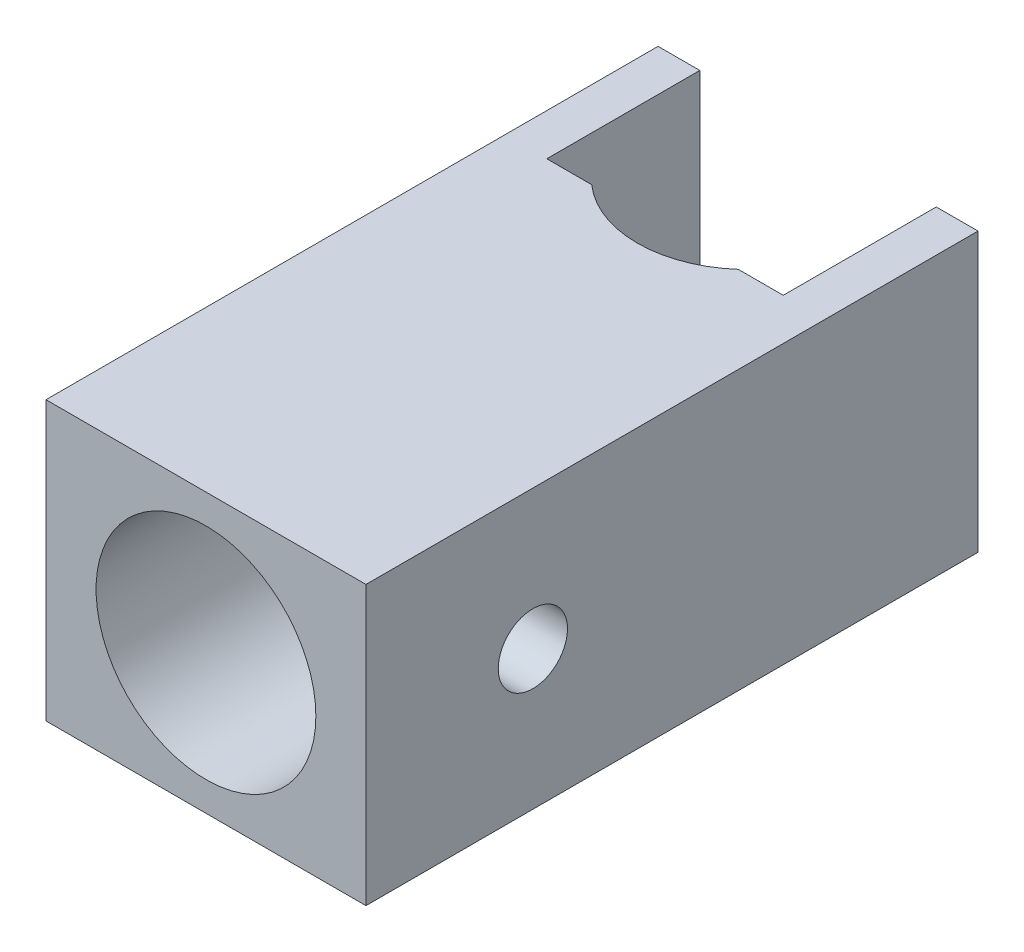
ISO-10303-21;
HEADER;
FILE_DESCRIPTION(('STEP AP214'),'2;1');
FILE_NAME('part.step','',(''),(''),'','','');
FILE_SCHEMA(('AUTOMOTIVE_DESIGN { 1 0 10303 214 1 1 1 1 }'));
ENDSEC;
DATA;
#1=APPLICATION_CONTEXT('core data for automotive mechanical design processes');
#2=APPLICATION_PROTOCOL_DEFINITION('international standard','automotive_design',2000,#1);
#3=PRODUCT_CONTEXT('',#1,'mechanical');
#4=PRODUCT('Part','Part','',(#3));
#5=PRODUCT_RELATED_PRODUCT_CATEGORY('part','',(#4));
#6=PRODUCT_DEFINITION_FORMATION('','',#4);
#7=PRODUCT_DEFINITION_CONTEXT('part definition',#1,'design');
#8=PRODUCT_DEFINITION('design','',#6,#7);
#9=PRODUCT_DEFINITION_SHAPE('','',#8);
#10=(LENGTH_UNIT() NAMED_UNIT(*) SI_UNIT(.MILLI.,.METRE.));
#11=(NAMED_UNIT(*) PLANE_ANGLE_UNIT() SI_UNIT($,.RADIAN.));
#12=(NAMED_UNIT(*) SI_UNIT($,.STERADIAN.) SOLID_ANGLE_UNIT());
#13=UNCERTAINTY_MEASURE_WITH_UNIT(LENGTH_MEASURE(1.E-05),#10,'distance_accuracy_value','');
#14=(GEOMETRIC_REPRESENTATION_CONTEXT(3) GLOBAL_UNCERTAINTY_ASSIGNED_CONTEXT((#13)) GLOBAL_UNIT_ASSIGNED_CONTEXT((#10,
#11,#12)) REPRESENTATION_CONTEXT('',''));
#15=CARTESIAN_POINT('',(0.,0.,0.));
#16=DIRECTION('',(0.,0.,1.));
#17=DIRECTION('',(1.,0.,0.));
#18=AXIS2_PLACEMENT_3D('',#15,#16,#17);
#19=CARTESIAN_POINT('',(-4.25,0.,-6.49999999999998));
#20=DIRECTION('',(0.,0.,1.));
#21=DIRECTION('',(0.,-1.,0.));
#22=AXIS2_PLACEMENT_3D('',#19,#20,#21);
#23=PLANE('',#22);
#24=DIRECTION('',(1.,0.,0.));
#25=VECTOR('',#24,1.);
#26=CARTESIAN_POINT('',(-4.25,4.5,-6.5));
#27=LINE('',#26,#25);
#28=CARTESIAN_POINT('',(2.63391343821318,4.5,-6.5));
#29=VERTEX_POINT('',#28);
#30=CARTESIAN_POINT('',(4.25,4.5,-6.5));
#31=VERTEX_POINT('',#30);
#32=EDGE_CURVE('E132',#29,#31,#27,.T.);
#33=ORIENTED_EDGE('',*,*,#32,.F.);
#34=DIRECTION('',(0.,1.,0.));
#35=VECTOR('',#34,1.);
#36=CARTESIAN_POINT('',(2.63391343821315,-4.99999999999999,-6.49999999999997));
#37=LINE('',#36,#35);
#38=CARTESIAN_POINT('',(2.63391343821318,5.,-6.5));
#39=VERTEX_POINT('',#38);
#40=EDGE_CURVE('E11',#29,#39,#37,.T.);
#41=ORIENTED_EDGE('',*,*,#40,.T.);
#42=DIRECTION('',(1.,0.,0.));
#43=VECTOR('',#42,1.);
#44=CARTESIAN_POINT('',(-4.25,5.,-6.5));
#45=LINE('',#44,#43);
#46=CARTESIAN_POINT('',(4.25,5.,-6.5));
#47=VERTEX_POINT('',#46);
#48=EDGE_CURVE('E131',#39,#47,#45,.T.);
#49=ORIENTED_EDGE('',*,*,#48,.T.);
#50=DIRECTION('',(0.,-1.,0.));
#51=VECTOR('',#50,1.);
#52=CARTESIAN_POINT('',(4.25,0.,-6.49999999999998));
#53=LINE('',#52,#51);
#54=EDGE_CURVE('E246',#47,#31,#53,.T.);
#55=ORIENTED_EDGE('',*,*,#54,.T.);
#56=EDGE_LOOP('',(#33,#41,#49,#55));
#57=FACE_BOUND('',#56,.T.);
#58=ADVANCED_FACE('F33',(#57),#23,.F.);
#59=CARTESIAN_POINT('',(0.,0.,-12.));
#60=DIRECTION('',(0.,0.,-1.));
#61=DIRECTION('',(-1.,0.,0.));
#62=AXIS2_PLACEMENT_3D('',#59,#60,#61);
#63=PLANE('',#62);
#64=DIRECTION('',(-1.,0.,0.));
#65=VECTOR('',#64,1.);
#66=CARTESIAN_POINT('',(-5.75,-5.,-12.));
#67=LINE('',#66,#65);
#68=CARTESIAN_POINT('',(5.75,-5.,-12.));
#69=VERTEX_POINT('',#68);
#70=CARTESIAN_POINT('',(4.25,-5.,-12.));
#71=VERTEX_POINT('',#70);
#72=EDGE_CURVE('E150',#69,#71,#67,.T.);
#73=ORIENTED_EDGE('',*,*,#72,.T.);
#74=DIRECTION('',(0.,-1.,0.));
#75=VECTOR('',#74,1.);
#76=CARTESIAN_POINT('',(4.25,0.,-12.));
#77=LINE('',#76,#75);
#78=CARTESIAN_POINT('',(4.25,5.,-12.));
#79=VERTEX_POINT('',#78);
#80=EDGE_CURVE('E249',#79,#71,#77,.T.);
#81=ORIENTED_EDGE('',*,*,#80,.F.);
#82=DIRECTION('',(1.,0.,0.));
#83=VECTOR('',#82,1.);
#84=CARTESIAN_POINT('',(-5.75,5.,-12.));
#85=LINE('',#84,#83);
#86=CARTESIAN_POINT('',(5.75,5.,-12.));
#87=VERTEX_POINT('',#86);
#88=EDGE_CURVE('E156',#79,#87,#85,.T.);
#89=ORIENTED_EDGE('',*,*,#88,.T.);
#90=DIRECTION('',(0.,-1.,0.));
#91=VECTOR('',#90,1.);
#92=CARTESIAN_POINT('',(5.75,-5.,-12.));
#93=LINE('',#92,#91);
#94=EDGE_CURVE('E146',#87,#69,#93,.T.);
#95=ORIENTED_EDGE('',*,*,#94,.T.);
#96=EDGE_LOOP('',(#73,#81,#89,#95));
#97=FACE_BOUND('',#96,.T.);
#98=ADVANCED_FACE('F299',(#97),#63,.T.);
#99=CARTESIAN_POINT('',(0.,0.,10.));
#100=DIRECTION('',(0.,0.,1.));
#101=DIRECTION('',(1.,0.,0.));
#102=AXIS2_PLACEMENT_3D('',#99,#100,#101);
#103=PLANE('',#102);
#104=DIRECTION('',(0.,-1.,0.));
#105=VECTOR('',#104,1.);
#106=CARTESIAN_POINT('',(-5.75,-5.,10.));
#107=LINE('',#106,#105);
#108=CARTESIAN_POINT('',(-5.75,5.,10.));
#109=VERTEX_POINT('',#108);
#110=CARTESIAN_POINT('',(-5.75,-5.,10.));
#111=VERTEX_POINT('',#110);
#112=EDGE_CURVE('E164',#109,#111,#107,.T.);
#113=ORIENTED_EDGE('',*,*,#112,.T.);
#114=DIRECTION('',(1.,0.,0.));
#115=VECTOR('',#114,1.);
#116=CARTESIAN_POINT('',(5.75,-5.,10.));
#117=LINE('',#116,#115);
#118=CARTESIAN_POINT('',(5.75,-5.,10.));
#119=VERTEX_POINT('',#118);
#120=EDGE_CURVE('E169',#111,#119,#117,.T.);
#121=ORIENTED_EDGE('',*,*,#120,.T.);
#122=DIRECTION('',(0.,1.,0.));
#123=VECTOR('',#122,1.);
#124=CARTESIAN_POINT('',(5.75,-5.,10.));
#125=LINE('',#124,#123);
#126=CARTESIAN_POINT('',(5.75,5.,10.));
#127=VERTEX_POINT('',#126);
#128=EDGE_CURVE('E171',#119,#127,#125,.T.);
#129=ORIENTED_EDGE('',*,*,#128,.T.);
#130=DIRECTION('',(-1.,0.,0.));
#131=VECTOR('',#130,1.);
#132=CARTESIAN_POINT('',(5.75,5.,10.));
#133=LINE('',#132,#131);
#134=EDGE_CURVE('E173',#127,#109,#133,.T.);
#135=ORIENTED_EDGE('',*,*,#134,.T.);
#136=EDGE_LOOP('',(#113,#121,#129,#135));
#137=FACE_BOUND('',#136,.T.);
#138=CARTESIAN_POINT('',(0.,0.,10.));
#139=DIRECTION('',(0.,0.,1.));
#140=DIRECTION('',(1.,0.,0.));
#141=AXIS2_PLACEMENT_3D('',#138,#139,#140);
#142=CIRCLE('',#141,3.95);
#143=CARTESIAN_POINT('',(3.95,0.,10.));
#144=VERTEX_POINT('',#143);
#145=EDGE_CURVE('E161',#144,#144,#142,.T.);
#146=ORIENTED_EDGE('',*,*,#145,.F.);
#147=EDGE_LOOP('',(#146));
#148=FACE_BOUND('',#147,.T.);
#149=ADVANCED_FACE('F291',(#137,#148),#103,.T.);
#150=CARTESIAN_POINT('',(-5.75,-5.,10.));
#151=DIRECTION('',(1.,0.,0.));
#152=DIRECTION('',(0.,0.,-1.));
#153=AXIS2_PLACEMENT_3D('',#150,#151,#152);
#154=PLANE('',#153);
#155=CARTESIAN_POINT('',(-5.75,0.,4.));
#156=DIRECTION('',(-1.,0.,0.));
#157=DIRECTION('',(0.,0.,1.));
#158=AXIS2_PLACEMENT_3D('',#155,#156,#157);
#159=CIRCLE('',#158,1.245);
#160=CARTESIAN_POINT('',(-5.75,0.,5.245));
#161=VERTEX_POINT('',#160);
#162=EDGE_CURVE('E238',#161,#161,#159,.T.);
#163=ORIENTED_EDGE('',*,*,#162,.F.);
#164=EDGE_LOOP('',(#163));
#165=FACE_BOUND('',#164,.T.);
#166=DIRECTION('',(0.,0.,-1.));
#167=VECTOR('',#166,1.);
#168=CARTESIAN_POINT('',(-5.75,5.,10.));
#169=LINE('',#168,#167);
#170=CARTESIAN_POINT('',(-5.75,5.,-12.));
#171=VERTEX_POINT('',#170);
#172=EDGE_CURVE('E175',#109,#171,#169,.T.);
#173=ORIENTED_EDGE('',*,*,#172,.T.);
#174=DIRECTION('',(0.,1.,0.));
#175=VECTOR('',#174,1.);
#176=CARTESIAN_POINT('',(-5.75,-5.,-12.));
#177=LINE('',#176,#175);
#178=CARTESIAN_POINT('',(-5.75,-5.,-12.));
#179=VERTEX_POINT('',#178);
#180=EDGE_CURVE('E153',#179,#171,#177,.T.);
#181=ORIENTED_EDGE('',*,*,#180,.F.);
#182=DIRECTION('',(0.,0.,-1.));
#183=VECTOR('',#182,1.);
#184=CARTESIAN_POINT('',(-5.75,-5.,10.));
#185=LINE('',#184,#183);
#186=EDGE_CURVE('E182',#111,#179,#185,.T.);
#187=ORIENTED_EDGE('',*,*,#186,.F.);
#188=ORIENTED_EDGE('',*,*,#112,.F.);
#189=EDGE_LOOP('',(#173,#181,#187,#188));
#190=FACE_BOUND('',#189,.T.);
#191=ADVANCED_FACE('F35',(#165,#190),#154,.F.);
#192=CARTESIAN_POINT('',(5.75,-5.,10.));
#193=DIRECTION('',(0.,1.,0.));
#194=DIRECTION('',(-1.,0.,0.));
#195=AXIS2_PLACEMENT_3D('',#192,#193,#194);
#196=PLANE('',#195);
#197=CARTESIAN_POINT('',(-4.25,-5.,-12.));
#198=VERTEX_POINT('',#197);
#199=EDGE_CURVE('E149',#198,#179,#67,.T.);
#200=ORIENTED_EDGE('',*,*,#199,.F.);
#201=DIRECTION('',(0.,0.,1.));
#202=VECTOR('',#201,1.);
#203=CARTESIAN_POINT('',(-4.25,-5.,0.));
#204=LINE('',#203,#202);
#205=CARTESIAN_POINT('',(-4.25,-5.,-3.5));
#206=VERTEX_POINT('',#205);
#207=EDGE_CURVE('E268',#198,#206,#204,.T.);
#208=ORIENTED_EDGE('',*,*,#207,.T.);
#209=DIRECTION('',(1.,0.,0.));
#210=VECTOR('',#209,1.);
#211=CARTESIAN_POINT('',(-4.25,-5.,-3.5));
#212=LINE('',#211,#210);
#213=CARTESIAN_POINT('',(4.25,-5.,-3.5));
#214=VERTEX_POINT('',#213);
#215=EDGE_CURVE('E136',#206,#214,#212,.T.);
#216=ORIENTED_EDGE('',*,*,#215,.T.);
#217=DIRECTION('',(0.,0.,1.));
#218=VECTOR('',#217,1.);
#219=CARTESIAN_POINT('',(4.25,-5.,0.));
#220=LINE('',#219,#218);
#221=EDGE_CURVE('E251',#71,#214,#220,.T.);
#222=ORIENTED_EDGE('',*,*,#221,.F.);
#223=ORIENTED_EDGE('',*,*,#72,.F.);
#224=DIRECTION('',(0.,0.,-1.));
#225=VECTOR('',#224,1.);
#226=CARTESIAN_POINT('',(5.75,-5.,10.));
#227=LINE('',#226,#225);
#228=EDGE_CURVE('E180',#119,#69,#227,.T.);
#229=ORIENTED_EDGE('',*,*,#228,.F.);
#230=ORIENTED_EDGE('',*,*,#120,.F.);
#231=ORIENTED_EDGE('',*,*,#186,.T.);
#232=EDGE_LOOP('',(#200,#208,#216,#222,#223,#229,#230,#231));
#233=FACE_BOUND('',#232,.T.);
#234=ADVANCED_FACE('F301',(#233),#196,.F.);
#235=CARTESIAN_POINT('',(5.75,-5.,10.));
#236=DIRECTION('',(-1.,0.,0.));
#237=DIRECTION('',(0.,0.,1.));
#238=AXIS2_PLACEMENT_3D('',#235,#236,#237);
#239=PLANE('',#238);
#240=CARTESIAN_POINT('',(5.75,0.,4.));
#241=DIRECTION('',(-1.,0.,0.));
#242=DIRECTION('',(0.,0.,1.));
#243=AXIS2_PLACEMENT_3D('',#240,#241,#242);
#244=CIRCLE('',#243,1.245);
#245=CARTESIAN_POINT('',(5.75,0.,5.245));
#246=VERTEX_POINT('',#245);
#247=EDGE_CURVE('E194',#246,#246,#244,.T.);
#248=ORIENTED_EDGE('',*,*,#247,.T.);
#249=EDGE_LOOP('',(#248));
#250=FACE_BOUND('',#249,.T.);
#251=ORIENTED_EDGE('',*,*,#228,.T.);
#252=ORIENTED_EDGE('',*,*,#94,.F.);
#253=DIRECTION('',(0.,0.,-1.));
#254=VECTOR('',#253,1.);
#255=CARTESIAN_POINT('',(5.75,5.,10.));
#256=LINE('',#255,#254);
#257=EDGE_CURVE('E177',#127,#87,#256,.T.);
#258=ORIENTED_EDGE('',*,*,#257,.F.);
#259=ORIENTED_EDGE('',*,*,#128,.F.);
#260=EDGE_LOOP('',(#251,#252,#258,#259));
#261=FACE_BOUND('',#260,.T.);
#262=ADVANCED_FACE('F296',(#250,#261),#239,.F.);
#263=CARTESIAN_POINT('',(5.75,5.,10.));
#264=DIRECTION('',(0.,-1.,0.));
#265=DIRECTION('',(1.,0.,0.));
#266=AXIS2_PLACEMENT_3D('',#263,#264,#265);
#267=PLANE('',#266);
#268=ORIENTED_EDGE('',*,*,#48,.F.);
#269=CARTESIAN_POINT('',(0.,5.,-9.46875));
#270=DIRECTION('',(0.,1.,0.));
#271=DIRECTION('',(-1.,0.,0.));
#272=AXIS2_PLACEMENT_3D('',#269,#270,#271);
#273=CIRCLE('',#272,3.96875);
#274=CARTESIAN_POINT('',(-2.63391343821319,5.,-6.5));
#275=VERTEX_POINT('',#274);
#276=EDGE_CURVE('E121',#275,#39,#273,.T.);
#277=ORIENTED_EDGE('',*,*,#276,.F.);
#278=CARTESIAN_POINT('',(-4.25,5.,-6.5));
#279=VERTEX_POINT('',#278);
#280=EDGE_CURVE('E135',#279,#275,#45,.T.);
#281=ORIENTED_EDGE('',*,*,#280,.F.);
#282=DIRECTION('',(0.,0.,-1.));
#283=VECTOR('',#282,1.);
#284=CARTESIAN_POINT('',(-4.25,5.,0.));
#285=LINE('',#284,#283);
#286=CARTESIAN_POINT('',(-4.25,5.,-12.));
#287=VERTEX_POINT('',#286);
#288=EDGE_CURVE('E262',#279,#287,#285,.T.);
#289=ORIENTED_EDGE('',*,*,#288,.T.);
#290=EDGE_CURVE('E157',#171,#287,#85,.T.);
#291=ORIENTED_EDGE('',*,*,#290,.F.);
#292=ORIENTED_EDGE('',*,*,#172,.F.);
#293=ORIENTED_EDGE('',*,*,#134,.F.);
#294=ORIENTED_EDGE('',*,*,#257,.T.);
#295=ORIENTED_EDGE('',*,*,#88,.F.);
#296=DIRECTION('',(0.,0.,-1.));
#297=VECTOR('',#296,1.);
#298=CARTESIAN_POINT('',(4.25,5.,0.));
#299=LINE('',#298,#297);
#300=EDGE_CURVE('E56',#47,#79,#299,.T.);
#301=ORIENTED_EDGE('',*,*,#300,.F.);
#302=EDGE_LOOP('',(#268,#277,#281,#289,#291,#292,#293,#294,#295,#301));
#303=FACE_BOUND('',#302,.T.);
#304=ADVANCED_FACE('F133',(#303),#267,.F.);
#305=CARTESIAN_POINT('',(0.,0.,10.));
#306=DIRECTION('',(0.,0.,-1.));
#307=DIRECTION('',(-1.,0.,0.));
#308=AXIS2_PLACEMENT_3D('',#305,#306,#307);
#309=CYLINDRICAL_SURFACE('',#308,3.95);
#310=CARTESIAN_POINT('',(-3.95,0.,5.245));
#311=CARTESIAN_POINT('',(-3.94999971994559,-0.0681359443127385,5.24499964444454));
#312=CARTESIAN_POINT('',(-3.94822042933649,-0.136275730647042,5.23938821469336));
#313=CARTESIAN_POINT('',(-3.94129692276376,-0.27056078832159,5.21715082381736));
#314=CARTESIAN_POINT('',(-3.93615199782934,-0.336705636356406,5.20052254198347));
#315=CARTESIAN_POINT('',(-3.92305889190845,-0.465045065974799,5.15686919859377));
#316=CARTESIAN_POINT('',(-3.91511509582237,-0.527245648074703,5.12986039388755));
#317=CARTESIAN_POINT('',(-3.89724326521328,-0.646235003975744,5.06628239747212));
#318=CARTESIAN_POINT('',(-3.88731490772157,-0.70302289468782,5.0297116493477));
#319=CARTESIAN_POINT('',(-3.86617843618548,-0.811356021880047,4.94684093150544));
#320=CARTESIAN_POINT('',(-3.85494208396079,-0.862707733042994,4.90029520631453));
#321=CARTESIAN_POINT('',(-3.83261853775384,-0.957020732808143,4.79931895903315));
#322=CARTESIAN_POINT('',(-3.82153137252393,-0.999980425011738,4.74488694017059));
#323=CARTESIAN_POINT('',(-3.80045756888665,-1.07734617723028,4.62799948499302));
#324=CARTESIAN_POINT('',(-3.79050572888031,-1.11150924742054,4.56537634766204));
#325=CARTESIAN_POINT('',(-3.7732546613281,-1.16873827508478,4.43490923054413));
#326=CARTESIAN_POINT('',(-3.76595472140582,-1.19180721330082,4.36706665878979));
#327=CARTESIAN_POINT('',(-3.7551295993572,-1.2254827457375,4.23027249472113));
#328=CARTESIAN_POINT('',(-3.7514958311297,-1.23644880090991,4.16141822742587));
#329=CARTESIAN_POINT('',(-3.74809223190538,-1.24673038781299,4.0227586392002));
#330=CARTESIAN_POINT('',(-3.74832135323782,-1.2460490784743,3.95295358126951));
#331=CARTESIAN_POINT('',(-3.7525218838509,-1.23333616362625,3.81735873584009));
#332=CARTESIAN_POINT('',(-3.75634213239035,-1.22176300399374,3.75152049168623));
#333=CARTESIAN_POINT('',(-3.76704868281807,-1.18833878880814,3.62277242937658));
#334=CARTESIAN_POINT('',(-3.77393531569869,-1.16648662370193,3.55986292816576));
#335=CARTESIAN_POINT('',(-3.79011349831228,-1.11280396284548,3.43767239945147));
#336=CARTESIAN_POINT('',(-3.79943913945473,-1.08083054424952,3.37845887073827));
#337=CARTESIAN_POINT('',(-3.81942912329456,-1.0079122340034,3.26608784434376));
#338=CARTESIAN_POINT('',(-3.83009381845546,-0.966964978151878,3.21293194819542));
#339=CARTESIAN_POINT('',(-3.85216521338302,-0.875017736437548,3.11159523017418));
#340=CARTESIAN_POINT('',(-3.86358339247057,-0.823639739243758,3.06375925472482));
#341=CARTESIAN_POINT('',(-3.88543964622898,-0.713449049756695,2.97729764892186));
#342=CARTESIAN_POINT('',(-3.89587764572114,-0.654635787997189,2.93867272469655));
#343=CARTESIAN_POINT('',(-3.91471034631737,-0.530571106897724,2.87149054548787));
#344=CARTESIAN_POINT('',(-3.92308792770831,-0.465271684666447,2.84301681286807));
#345=CARTESIAN_POINT('',(-3.93673221313179,-0.330484157110877,2.79756108784868));
#346=CARTESIAN_POINT('',(-3.94199987871574,-0.260997353809071,2.78057554319221));
#347=CARTESIAN_POINT('',(-3.9486755071473,-0.122733702975354,2.75916873047891));
#348=CARTESIAN_POINT('',(-3.95022677016459,-0.0540359310981754,2.7542807360381));
#349=CARTESIAN_POINT('',(-3.94971937448267,0.0832063324290602,2.755890135661));
#350=CARTESIAN_POINT('',(-3.94766125326341,0.15175084537932,2.76238583455823));
#351=CARTESIAN_POINT('',(-3.94026056818389,0.284932111116973,2.7862041837809));
#352=CARTESIAN_POINT('',(-3.93500264224077,0.349623884342487,2.80324801652287));
#353=CARTESIAN_POINT('',(-3.92181911670026,0.47521055339548,2.84733755627589));
#354=CARTESIAN_POINT('',(-3.91389318598478,0.536104976832891,2.8743845047848));
#355=CARTESIAN_POINT('',(-3.89594437873399,0.654037650107437,2.93845678457836));
#356=CARTESIAN_POINT('',(-3.88587464653976,0.710943917114736,2.97571155704897));
#357=CARTESIAN_POINT('',(-3.86478853577862,0.817853073105867,3.05886742850054));
#358=CARTESIAN_POINT('',(-3.85377189672657,0.86785405258602,3.10477091082626));
#359=CARTESIAN_POINT('',(-3.83147354711285,0.961628487694156,3.20611660395225));
#360=CARTESIAN_POINT('',(-3.820199080256,1.00506920728263,3.26186899308843));
#361=CARTESIAN_POINT('',(-3.79912517990125,1.08200956915713,3.38011694919357));
#362=CARTESIAN_POINT('',(-3.78932572682773,1.11550934337995,3.44261242665288));
#363=CARTESIAN_POINT('',(-3.77241882481076,1.1714142030766,3.57246078622128));
#364=CARTESIAN_POINT('',(-3.76530151192532,1.19386003631894,3.63979476382691));
#365=CARTESIAN_POINT('',(-3.75463055116552,1.22701207137361,3.77755762271274));
#366=CARTESIAN_POINT('',(-3.75107551684928,1.23772284063466,3.84798528877786));
#367=CARTESIAN_POINT('',(-3.74807779186866,1.24676902849043,3.98645306818158));
#368=CARTESIAN_POINT('',(-3.7484534453693,1.24565108076133,4.05445397267544));
#369=CARTESIAN_POINT('',(-3.75283248448126,1.23239440439405,4.1892478401304));
#370=CARTESIAN_POINT('',(-3.75683569533609,1.22025620665307,4.25604086112282));
#371=CARTESIAN_POINT('',(-3.76789077359774,1.18567226218266,4.38552688904147));
#372=CARTESIAN_POINT('',(-3.77489551834482,1.16338551700276,4.44826669160636));
#373=CARTESIAN_POINT('',(-3.79115166585344,1.10926271975609,4.56916634937097));
#374=CARTESIAN_POINT('',(-3.80040353116877,1.07742470130991,4.62732525835803));
#375=CARTESIAN_POINT('',(-3.82056973466089,1.00362512291244,4.73991228125994));
#376=CARTESIAN_POINT('',(-3.83153549509263,0.961311806390145,4.79410058424986));
#377=CARTESIAN_POINT('',(-3.85366020286422,0.868378627061713,4.89478452689622));
#378=CARTESIAN_POINT('',(-3.86481920150794,0.817756527102403,4.94127808794136));
#379=CARTESIAN_POINT('',(-3.88652054999418,0.707607406084408,5.02680982183952));
#380=CARTESIAN_POINT('',(-3.89702982165129,0.647839296526167,5.06554685800059));
#381=CARTESIAN_POINT('',(-3.91582839568085,0.52230876446891,5.13237341317725));
#382=CARTESIAN_POINT('',(-3.92411853312522,0.456548609330066,5.16046693905952));
#383=CARTESIAN_POINT('',(-3.93699936408523,0.326301640814411,5.20327532922915));
#384=CARTESIAN_POINT('',(-3.94183180937883,0.26212937831984,5.21887639516512));
#385=CARTESIAN_POINT('',(-3.94833192944018,0.131972355095211,5.23973781299759));
#386=CARTESIAN_POINT('',(-3.95000027122578,0.0659879793489372,5.24500034434668));
#387=CARTESIAN_POINT('',(-3.95,0.,5.245));
#388=B_SPLINE_CURVE_WITH_KNOTS('',3,(#310,#311,#312,#313,#314,#315,#316,#317,#318,#319,#320,
#321,#322,#323,#324,#325,#326,#327,#328,#329,#330,#331,#332,#333,#334,#335,#336,#337,#338,#339,
#340,#341,#342,#343,#344,#345,#346,#347,#348,#349,#350,#351,#352,#353,#354,#355,#356,#357,#358,
#359,#360,#361,#362,#363,#364,#365,#366,#367,#368,#369,#370,#371,#372,#373,#374,#375,#376,#377,
#378,#379,#380,#381,#382,#383,#384,#385,#386,#387),.UNSPECIFIED.,.T.,.F.,(4,2,2,2,2,2,2,2,2,2,2,
2,2,2,2,2,2,2,2,2,2,2,2,2,2,2,2,2,2,2,2,2,2,2,2,2,2,2,4),(0.,0.204165247054077,
0.408373515367364,0.612263269466365,0.81618623176039,1.02587243168786,1.23559848108202,
1.45061270196935,1.66556912108456,1.8739534356892,2.08228123440586,2.28221483966654,
2.48217003143946,2.68508520397507,2.88805389990937,3.10043133699313,3.31282504991095,
3.52692802821868,3.74096477354804,3.94660542056443,4.15221544785997,4.35260994207886,
4.55302931583293,4.75838690327725,4.9638011645726,5.1775048466912,5.39120569239553,
5.60411277072844,5.81693695322064,6.01997063410957,6.22299453443169,6.42294155399286,
6.62292976616005,6.83085834121074,7.03884299347933,7.25377946012428,7.46863493097558,
7.66640562683522,7.86413462644426),.UNSPECIFIED.);
#389=CARTESIAN_POINT('',(-3.95,0.,5.245));
#390=VERTEX_POINT('',#389);
#391=EDGE_CURVE('E193',#390,#390,#388,.T.);
#392=ORIENTED_EDGE('',*,*,#391,.F.);
#393=EDGE_LOOP('',(#392));
#394=FACE_BOUND('',#393,.T.);
#395=CARTESIAN_POINT('',(3.95,0.,5.245));
#396=CARTESIAN_POINT('',(3.94999971994559,0.0681359443127385,5.24499964444454));
#397=CARTESIAN_POINT('',(3.94822042933649,0.136275730647042,5.23938821469336));
#398=CARTESIAN_POINT('',(3.94129692276376,0.27056078832159,5.21715082381736));
#399=CARTESIAN_POINT('',(3.93615199782934,0.336705636356406,5.20052254198347));
#400=CARTESIAN_POINT('',(3.92305889190845,0.465045065974799,5.15686919859377));
#401=CARTESIAN_POINT('',(3.91511509582237,0.527245648074703,5.12986039388755));
#402=CARTESIAN_POINT('',(3.89724326521328,0.646235003975744,5.06628239747212));
#403=CARTESIAN_POINT('',(3.88731490772157,0.70302289468782,5.0297116493477));
#404=CARTESIAN_POINT('',(3.86617843618548,0.811356021880047,4.94684093150544));
#405=CARTESIAN_POINT('',(3.85494208396079,0.862707733042994,4.90029520631453));
#406=CARTESIAN_POINT('',(3.83261853775384,0.957020732808143,4.79931895903315));
#407=CARTESIAN_POINT('',(3.82153137252393,0.999980425011738,4.74488694017059));
#408=CARTESIAN_POINT('',(3.80045756888665,1.07734617723028,4.62799948499302));
#409=CARTESIAN_POINT('',(3.79050572888031,1.11150924742054,4.56537634766204));
#410=CARTESIAN_POINT('',(3.7732546613281,1.16873827508478,4.43490923054413));
#411=CARTESIAN_POINT('',(3.76595472140582,1.19180721330082,4.36706665878979));
#412=CARTESIAN_POINT('',(3.7551295993572,1.2254827457375,4.23027249472113));
#413=CARTESIAN_POINT('',(3.7514958311297,1.23644880090991,4.16141822742587));
#414=CARTESIAN_POINT('',(3.74809223190538,1.24673038781299,4.0227586392002));
#415=CARTESIAN_POINT('',(3.74832135323782,1.2460490784743,3.95295358126951));
#416=CARTESIAN_POINT('',(3.7525218838509,1.23333616362625,3.81735873584009));
#417=CARTESIAN_POINT('',(3.75634213239035,1.22176300399374,3.75152049168623));
#418=CARTESIAN_POINT('',(3.76704868281807,1.18833878880814,3.62277242937658));
#419=CARTESIAN_POINT('',(3.77393531569869,1.16648662370193,3.55986292816576));
#420=CARTESIAN_POINT('',(3.79011349831228,1.11280396284548,3.43767239945147));
#421=CARTESIAN_POINT('',(3.79943913945473,1.08083054424952,3.37845887073827));
#422=CARTESIAN_POINT('',(3.81942912329456,1.0079122340034,3.26608784434376));
#423=CARTESIAN_POINT('',(3.83009381845546,0.966964978151878,3.21293194819542));
#424=CARTESIAN_POINT('',(3.85216521338302,0.875017736437548,3.11159523017418));
#425=CARTESIAN_POINT('',(3.86358339247057,0.823639739243758,3.06375925472482));
#426=CARTESIAN_POINT('',(3.88543964622898,0.713449049756695,2.97729764892186));
#427=CARTESIAN_POINT('',(3.89587764572114,0.654635787997189,2.93867272469655));
#428=CARTESIAN_POINT('',(3.91471034631737,0.530571106897724,2.87149054548787));
#429=CARTESIAN_POINT('',(3.92308792770831,0.465271684666447,2.84301681286807));
#430=CARTESIAN_POINT('',(3.93673221313179,0.330484157110877,2.79756108784868));
#431=CARTESIAN_POINT('',(3.94199987871574,0.260997353809071,2.78057554319221));
#432=CARTESIAN_POINT('',(3.9486755071473,0.122733702975354,2.75916873047891));
#433=CARTESIAN_POINT('',(3.95022677016459,0.0540359310981754,2.7542807360381));
#434=CARTESIAN_POINT('',(3.94971937448267,-0.0832063324290602,2.755890135661));
#435=CARTESIAN_POINT('',(3.94766125326341,-0.15175084537932,2.76238583455823));
#436=CARTESIAN_POINT('',(3.94026056818389,-0.284932111116973,2.7862041837809));
#437=CARTESIAN_POINT('',(3.93500264224077,-0.349623884342487,2.80324801652287));
#438=CARTESIAN_POINT('',(3.92181911670026,-0.47521055339548,2.84733755627589));
#439=CARTESIAN_POINT('',(3.91389318598478,-0.536104976832891,2.8743845047848));
#440=CARTESIAN_POINT('',(3.89594437873399,-0.654037650107437,2.93845678457836));
#441=CARTESIAN_POINT('',(3.88587464653976,-0.710943917114736,2.97571155704897));
#442=CARTESIAN_POINT('',(3.86478853577862,-0.817853073105867,3.05886742850054));
#443=CARTESIAN_POINT('',(3.85377189672657,-0.86785405258602,3.10477091082626));
#444=CARTESIAN_POINT('',(3.83147354711285,-0.961628487694156,3.20611660395225));
#445=CARTESIAN_POINT('',(3.820199080256,-1.00506920728263,3.26186899308843));
#446=CARTESIAN_POINT('',(3.79912517990125,-1.08200956915713,3.38011694919357));
#447=CARTESIAN_POINT('',(3.78932572682773,-1.11550934337995,3.44261242665288));
#448=CARTESIAN_POINT('',(3.77241882481076,-1.1714142030766,3.57246078622128));
#449=CARTESIAN_POINT('',(3.76530151192532,-1.19386003631894,3.63979476382691));
#450=CARTESIAN_POINT('',(3.75463055116552,-1.22701207137361,3.77755762271274));
#451=CARTESIAN_POINT('',(3.75107551684928,-1.23772284063466,3.84798528877786));
#452=CARTESIAN_POINT('',(3.74807779186866,-1.24676902849043,3.98645306818158));
#453=CARTESIAN_POINT('',(3.7484534453693,-1.24565108076133,4.05445397267544));
#454=CARTESIAN_POINT('',(3.75283248448126,-1.23239440439405,4.1892478401304));
#455=CARTESIAN_POINT('',(3.75683569533609,-1.22025620665307,4.25604086112282));
#456=CARTESIAN_POINT('',(3.76789077359774,-1.18567226218266,4.38552688904147));
#457=CARTESIAN_POINT('',(3.77489551834482,-1.16338551700276,4.44826669160636));
#458=CARTESIAN_POINT('',(3.79115166585344,-1.10926271975609,4.56916634937097));
#459=CARTESIAN_POINT('',(3.80040353116877,-1.07742470130991,4.62732525835803));
#460=CARTESIAN_POINT('',(3.82056973466089,-1.00362512291244,4.73991228125994));
#461=CARTESIAN_POINT('',(3.83153549509263,-0.961311806390145,4.79410058424986));
#462=CARTESIAN_POINT('',(3.85366020286422,-0.868378627061713,4.89478452689622));
#463=CARTESIAN_POINT('',(3.86481920150794,-0.817756527102403,4.94127808794136));
#464=CARTESIAN_POINT('',(3.88652054999418,-0.707607406084408,5.02680982183952));
#465=CARTESIAN_POINT('',(3.89702982165129,-0.647839296526167,5.06554685800059));
#466=CARTESIAN_POINT('',(3.91582839568085,-0.52230876446891,5.13237341317725));
#467=CARTESIAN_POINT('',(3.92411853312522,-0.456548609330066,5.16046693905952));
#468=CARTESIAN_POINT('',(3.93699936408523,-0.326301640814411,5.20327532922915));
#469=CARTESIAN_POINT('',(3.94183180937883,-0.26212937831984,5.21887639516512));
#470=CARTESIAN_POINT('',(3.94833192944018,-0.131972355095211,5.23973781299759));
#471=CARTESIAN_POINT('',(3.95000027122578,-0.0659879793489372,5.24500034434668));
#472=CARTESIAN_POINT('',(3.95,0.,5.245));
#473=B_SPLINE_CURVE_WITH_KNOTS('',3,(#395,#396,#397,#398,#399,#400,#401,#402,#403,#404,#405,
#406,#407,#408,#409,#410,#411,#412,#413,#414,#415,#416,#417,#418,#419,#420,#421,#422,#423,#424,
#425,#426,#427,#428,#429,#430,#431,#432,#433,#434,#435,#436,#437,#438,#439,#440,#441,#442,#443,
#444,#445,#446,#447,#448,#449,#450,#451,#452,#453,#454,#455,#456,#457,#458,#459,#460,#461,#462,
#463,#464,#465,#466,#467,#468,#469,#470,#471,#472),.UNSPECIFIED.,.T.,.F.,(4,2,2,2,2,2,2,2,2,2,2,
2,2,2,2,2,2,2,2,2,2,2,2,2,2,2,2,2,2,2,2,2,2,2,2,2,2,2,4),(0.,0.204165247054077,
0.408373515367364,0.612263269466365,0.81618623176039,1.02587243168786,1.23559848108202,
1.45061270196935,1.66556912108456,1.8739534356892,2.08228123440586,2.28221483966654,
2.48217003143946,2.68508520397507,2.88805389990937,3.10043133699313,3.31282504991095,
3.52692802821868,3.74096477354804,3.94660542056443,4.15221544785997,4.35260994207886,
4.55302931583293,4.75838690327725,4.9638011645726,5.1775048466912,5.39120569239553,
5.60411277072844,5.81693695322064,6.01997063410957,6.22299453443169,6.42294155399286,
6.62292976616005,6.83085834121074,7.03884299347933,7.25377946012428,7.46863493097558,
7.66640562683522,7.86413462644426),.UNSPECIFIED.);
#474=CARTESIAN_POINT('',(3.95,0.,5.245));
#475=VERTEX_POINT('',#474);
#476=EDGE_CURVE('E185',#475,#475,#473,.T.);
#477=ORIENTED_EDGE('',*,*,#476,.F.);
#478=EDGE_LOOP('',(#477));
#479=FACE_BOUND('',#478,.T.);
#480=ORIENTED_EDGE('',*,*,#145,.T.);
#481=EDGE_LOOP('',(#480));
#482=FACE_BOUND('',#481,.T.);
#483=CARTESIAN_POINT('',(0.,0.,0.));
#484=DIRECTION('',(0.,0.,1.));
#485=DIRECTION('',(1.,0.,0.));
#486=AXIS2_PLACEMENT_3D('',#483,#484,#485);
#487=CIRCLE('',#486,3.95);
#488=CARTESIAN_POINT('',(3.95,0.,0.));
#489=VERTEX_POINT('',#488);
#490=EDGE_CURVE('E160',#489,#489,#487,.T.);
#491=ORIENTED_EDGE('',*,*,#490,.F.);
#492=EDGE_LOOP('',(#491));
#493=FACE_BOUND('',#492,.T.);
#494=ADVANCED_FACE('F198',(#394,#479,#482,#493),#309,.F.);
#495=CARTESIAN_POINT('',(0.,0.,0.));
#496=DIRECTION('',(0.,0.,-1.));
#497=DIRECTION('',(-1.,0.,0.));
#498=AXIS2_PLACEMENT_3D('',#495,#496,#497);
#499=PLANE('',#498);
#500=ORIENTED_EDGE('',*,*,#490,.T.);
#501=EDGE_LOOP('',(#500));
#502=FACE_BOUND('',#501,.T.);
#503=ADVANCED_FACE('F318',(#502),#499,.F.);
#504=DIRECTION('',(0.,-1.,0.));
#505=VECTOR('',#504,1.);
#506=CARTESIAN_POINT('',(-4.25,0.,-12.));
#507=LINE('',#506,#505);
#508=EDGE_CURVE('E265',#287,#198,#507,.T.);
#509=ORIENTED_EDGE('',*,*,#508,.T.);
#510=ORIENTED_EDGE('',*,*,#199,.T.);
#511=ORIENTED_EDGE('',*,*,#180,.T.);
#512=ORIENTED_EDGE('',*,*,#290,.T.);
#513=EDGE_LOOP('',(#509,#510,#511,#512));
#514=FACE_BOUND('',#513,.T.);
#515=ADVANCED_FACE('F230',(#514),#63,.T.);
#516=CARTESIAN_POINT('',(-4.25,1.70715199124621,-6.3));
#517=DIRECTION('',(1.,0.,0.));
#518=DIRECTION('',(0.,0.,-1.));
#519=AXIS2_PLACEMENT_3D('',#516,#517,#518);
#520=CYLINDRICAL_SURFACE('',#519,2.8);
#521=CARTESIAN_POINT('',(-4.25,4.5,-6.5));
#522=VERTEX_POINT('',#521);
#523=CARTESIAN_POINT('',(-2.63391343821315,4.5,-6.5));
#524=VERTEX_POINT('',#523);
#525=EDGE_CURVE('E143',#522,#524,#27,.T.);
#526=ORIENTED_EDGE('',*,*,#525,.T.);
#527=CARTESIAN_POINT('',(-2.63391343821318,4.5,-6.5));
#528=CARTESIAN_POINT('',(-2.54431492662216,4.50567058868595,-6.42047065569621));
#529=CARTESIAN_POINT('',(-2.45103083660068,4.50768740935084,-6.34499392058735));
#530=CARTESIAN_POINT('',(-2.25814686224973,4.50637379320268,-6.20286197323721));
#531=CARTESIAN_POINT('',(-2.15855418092285,4.50304935285745,-6.13619695926148));
#532=CARTESIAN_POINT('',(-1.95404215255339,4.49302424052618,-6.01230770929224));
#533=CARTESIAN_POINT('',(-1.84913022831434,4.48632816293583,-5.95507076652126));
#534=CARTESIAN_POINT('',(-1.63465450382488,4.47131213006342,-5.8503082173693));
#535=CARTESIAN_POINT('',(-1.5250899130003,4.46299189793657,-5.80278426944509));
#536=CARTESIAN_POINT('',(-1.31526830072237,4.44727980430672,-5.72280182783747));
#537=CARTESIAN_POINT('',(-1.21543371744958,4.43989394298499,-5.68922846756968));
#538=CARTESIAN_POINT('',(-1.01335743248891,4.42600651865115,-5.63010926975836));
#539=CARTESIAN_POINT('',(-0.911115921068319,4.41950488601443,-5.60456279996559));
#540=CARTESIAN_POINT('',(-0.704950293152168,4.40815088595085,-5.56169301032195));
#541=CARTESIAN_POINT('',(-0.601028197551801,4.40329667255567,-5.54436047788605));
#542=CARTESIAN_POINT('',(-0.392049883770837,4.39577176108021,-5.51800763912984));
#543=CARTESIAN_POINT('',(-0.286993613339157,4.39310116403715,-5.50898771743647));
#544=CARTESIAN_POINT('',(-0.0718090839530533,4.39017794889297,-5.49912463921275));
#545=CARTESIAN_POINT('',(0.0383383203131912,4.39003729326501,-5.49866007923144));
#546=CARTESIAN_POINT('',(0.258262550054247,4.39247946635677,-5.50688340463789));
#547=CARTESIAN_POINT('',(0.368039359966253,4.3950624080589,-5.51557166971035));
#548=CARTESIAN_POINT('',(0.586572895381868,4.40264587217431,-5.54204116600024));
#549=CARTESIAN_POINT('',(0.695327815773627,4.40765006504278,-5.55983620484959));
#550=CARTESIAN_POINT('',(0.910881797423293,4.41946414479237,-5.60437639994596));
#551=CARTESIAN_POINT('',(1.01768091307926,4.42627398137017,-5.63112130686456));
#552=CARTESIAN_POINT('',(1.22710701102895,4.44072803269417,-5.69291457340027));
#553=CARTESIAN_POINT('',(1.32977193723152,4.44835880990663,-5.72783772590106));
#554=CARTESIAN_POINT('',(1.53190793907273,4.46351090310214,-5.80596761969871));
#555=CARTESIAN_POINT('',(1.63137906846426,4.47103222092626,-5.84917422149638));
#556=CARTESIAN_POINT('',(1.82629549718738,4.48477347167131,-5.94350997191027));
#557=CARTESIAN_POINT('',(1.92174975042243,4.49099643644704,-5.99462016676979));
#558=CARTESIAN_POINT('',(2.10822130487845,4.50086381976814,-6.10451456416892));
#559=CARTESIAN_POINT('',(2.19924125420185,4.50450979527391,-6.16329410758008));
#560=CARTESIAN_POINT('',(2.34792797245832,4.50729344947119,-6.26818135608737));
#561=CARTESIAN_POINT('',(2.40695893634555,4.50749941775652,-6.31233667348133));
#562=CARTESIAN_POINT('',(2.52242869580083,4.50559964593994,-6.4038255429556));
#563=CARTESIAN_POINT('',(2.57886838821876,4.50349471203117,-6.45115798124238));
#564=CARTESIAN_POINT('',(2.63391343821318,4.5,-6.5));
#565=B_SPLINE_CURVE_WITH_KNOTS('',3,(#527,#528,#529,#530,#531,#532,#533,#534,#535,#536,#537,
#538,#539,#540,#541,#542,#543,#544,#545,#546,#547,#548,#549,#550,#551,#552,#553,#554,#555,#556,
#557,#558,#559,#560,#561,#562,#563,#564),.UNSPECIFIED.,.F.,.F.,(4,2,2,2,2,2,2,2,2,2,2,2,2,2,2,2,
2,2,4),(0.,0.359483659039081,0.718564018867971,1.07715639304336,1.43580994443902,
1.75224760036176,2.06866032537871,2.38471732347207,2.70078894488143,3.03081549938111,
3.36085574484148,3.69139788432903,4.0219308162291,4.34770073820824,4.67346517447127,
4.9984601691821,5.32325864080813,5.54427343663095,5.76521115259826),.UNSPECIFIED.);
#566=EDGE_CURVE('E48',#524,#29,#565,.T.);
#567=ORIENTED_EDGE('',*,*,#566,.T.);
#568=ORIENTED_EDGE('',*,*,#32,.T.);
#569=CARTESIAN_POINT('',(4.25,1.70715199124621,-6.3));
#570=DIRECTION('',(-1.,0.,0.));
#571=DIRECTION('',(0.,0.,1.));
#572=AXIS2_PLACEMENT_3D('',#569,#570,#571);
#573=CIRCLE('',#572,2.8);
#574=CARTESIAN_POINT('',(4.25,1.70715199124621,-3.5));
#575=VERTEX_POINT('',#574);
#576=EDGE_CURVE('E243',#31,#575,#573,.F.);
#577=ORIENTED_EDGE('',*,*,#576,.T.);
#578=DIRECTION('',(1.,0.,0.));
#579=VECTOR('',#578,1.);
#580=CARTESIAN_POINT('',(-4.25,1.70715199124621,-3.5));
#581=LINE('',#580,#579);
#582=CARTESIAN_POINT('',(-4.25,1.70715199124621,-3.5));
#583=VERTEX_POINT('',#582);
#584=EDGE_CURVE('E139',#583,#575,#581,.T.);
#585=ORIENTED_EDGE('',*,*,#584,.F.);
#586=CARTESIAN_POINT('',(-4.25,1.70715199124621,-6.3));
#587=DIRECTION('',(-1.,0.,0.));
#588=DIRECTION('',(0.,0.,1.));
#589=AXIS2_PLACEMENT_3D('',#586,#587,#588);
#590=CIRCLE('',#589,2.8);
#591=EDGE_CURVE('E256',#522,#583,#590,.F.);
#592=ORIENTED_EDGE('',*,*,#591,.F.);
#593=EDGE_LOOP('',(#526,#567,#568,#577,#585,#592));
#594=FACE_BOUND('',#593,.T.);
#595=ADVANCED_FACE('F225',(#594),#520,.F.);
#596=ORIENTED_EDGE('',*,*,#280,.T.);
#597=DIRECTION('',(0.,1.,0.));
#598=VECTOR('',#597,1.);
#599=CARTESIAN_POINT('',(-2.63391343821314,-4.99999999999999,-6.49999999999997));
#600=LINE('',#599,#598);
#601=EDGE_CURVE('E41',#275,#524,#600,.F.);
#602=ORIENTED_EDGE('',*,*,#601,.T.);
#603=ORIENTED_EDGE('',*,*,#525,.F.);
#604=DIRECTION('',(0.,-1.,0.));
#605=VECTOR('',#604,1.);
#606=CARTESIAN_POINT('',(-4.25,0.,-6.49999999999998));
#607=LINE('',#606,#605);
#608=EDGE_CURVE('E259',#279,#522,#607,.T.);
#609=ORIENTED_EDGE('',*,*,#608,.F.);
#610=EDGE_LOOP('',(#596,#602,#603,#609));
#611=FACE_BOUND('',#610,.T.);
#612=ADVANCED_FACE('F221',(#611),#23,.F.);
#613=CARTESIAN_POINT('',(-4.25,0.,-3.5));
#614=DIRECTION('',(0.,0.,1.));
#615=DIRECTION('',(0.,-1.,0.));
#616=AXIS2_PLACEMENT_3D('',#613,#614,#615);
#617=PLANE('',#616);
#618=ORIENTED_EDGE('',*,*,#215,.F.);
#619=DIRECTION('',(0.,-1.,0.));
#620=VECTOR('',#619,1.);
#621=CARTESIAN_POINT('',(-4.25,0.,-3.5));
#622=LINE('',#621,#620);
#623=EDGE_CURVE('E271',#583,#206,#622,.T.);
#624=ORIENTED_EDGE('',*,*,#623,.F.);
#625=ORIENTED_EDGE('',*,*,#584,.T.);
#626=DIRECTION('',(0.,-1.,0.));
#627=VECTOR('',#626,1.);
#628=CARTESIAN_POINT('',(4.25,0.,-3.5));
#629=LINE('',#628,#627);
#630=EDGE_CURVE('E254',#575,#214,#629,.T.);
#631=ORIENTED_EDGE('',*,*,#630,.T.);
#632=EDGE_LOOP('',(#618,#624,#625,#631));
#633=FACE_BOUND('',#632,.T.);
#634=ADVANCED_FACE('F217',(#633),#617,.F.);
#635=CARTESIAN_POINT('',(-4.25,0.,0.));
#636=DIRECTION('',(-1.,0.,0.));
#637=DIRECTION('',(0.,0.,1.));
#638=AXIS2_PLACEMENT_3D('',#635,#636,#637);
#639=PLANE('',#638);
#640=ORIENTED_EDGE('',*,*,#591,.T.);
#641=ORIENTED_EDGE('',*,*,#623,.T.);
#642=ORIENTED_EDGE('',*,*,#207,.F.);
#643=ORIENTED_EDGE('',*,*,#508,.F.);
#644=ORIENTED_EDGE('',*,*,#288,.F.);
#645=ORIENTED_EDGE('',*,*,#608,.T.);
#646=EDGE_LOOP('',(#640,#641,#642,#643,#644,#645));
#647=FACE_BOUND('',#646,.T.);
#648=ADVANCED_FACE('F214',(#647),#639,.F.);
#649=CARTESIAN_POINT('',(4.25,0.,0.));
#650=DIRECTION('',(-1.,0.,0.));
#651=DIRECTION('',(0.,0.,1.));
#652=AXIS2_PLACEMENT_3D('',#649,#650,#651);
#653=PLANE('',#652);
#654=ORIENTED_EDGE('',*,*,#576,.F.);
#655=ORIENTED_EDGE('',*,*,#54,.F.);
#656=ORIENTED_EDGE('',*,*,#300,.T.);
#657=ORIENTED_EDGE('',*,*,#80,.T.);
#658=ORIENTED_EDGE('',*,*,#221,.T.);
#659=ORIENTED_EDGE('',*,*,#630,.F.);
#660=EDGE_LOOP('',(#654,#655,#656,#657,#658,#659));
#661=FACE_BOUND('',#660,.T.);
#662=ADVANCED_FACE('F208',(#661),#653,.T.);
#663=CARTESIAN_POINT('',(5.75,0.,4.));
#664=DIRECTION('',(-1.,0.,0.));
#665=DIRECTION('',(0.,0.,1.));
#666=AXIS2_PLACEMENT_3D('',#663,#664,#665);
#667=CYLINDRICAL_SURFACE('',#666,1.245);
#668=ORIENTED_EDGE('',*,*,#476,.T.);
#669=EDGE_LOOP('',(#668));
#670=FACE_BOUND('',#669,.T.);
#671=ORIENTED_EDGE('',*,*,#247,.F.);
#672=EDGE_LOOP('',(#671));
#673=FACE_BOUND('',#672,.T.);
#674=ADVANCED_FACE('F202',(#670,#673),#667,.F.);
#675=ORIENTED_EDGE('',*,*,#391,.T.);
#676=EDGE_LOOP('',(#675));
#677=FACE_BOUND('',#676,.T.);
#678=ORIENTED_EDGE('',*,*,#162,.T.);
#679=EDGE_LOOP('',(#678));
#680=FACE_BOUND('',#679,.T.);
#681=ADVANCED_FACE('F207',(#677,#680),#667,.F.);
#682=CARTESIAN_POINT('',(0.,-5.,-9.46875));
#683=DIRECTION('',(0.,1.,0.));
#684=DIRECTION('',(-1.,0.,0.));
#685=AXIS2_PLACEMENT_3D('',#682,#683,#684);
#686=CYLINDRICAL_SURFACE('',#685,3.96875);
#687=ORIENTED_EDGE('',*,*,#601,.F.);
#688=ORIENTED_EDGE('',*,*,#276,.T.);
#689=ORIENTED_EDGE('',*,*,#40,.F.);
#690=ORIENTED_EDGE('',*,*,#566,.F.);
#691=EDGE_LOOP('',(#687,#688,#689,#690));
#692=FACE_BOUND('',#691,.T.);
#693=ADVANCED_FACE('F122',(#692),#686,.F.);
#694=CLOSED_SHELL('',(#58,#98,#149,#191,#234,#262,#304,#494,#503,#515,#595,#612,#634,#648,#662,
#674,#681,#693));
#695=MANIFOLD_SOLID_BREP('B2',#694);
#696=ADVANCED_BREP_SHAPE_REPRESENTATION('',(#18,#695),#14);
#697=SHAPE_DEFINITION_REPRESENTATION(#9,#696);
ENDSEC;
END-ISO-10303-21;
